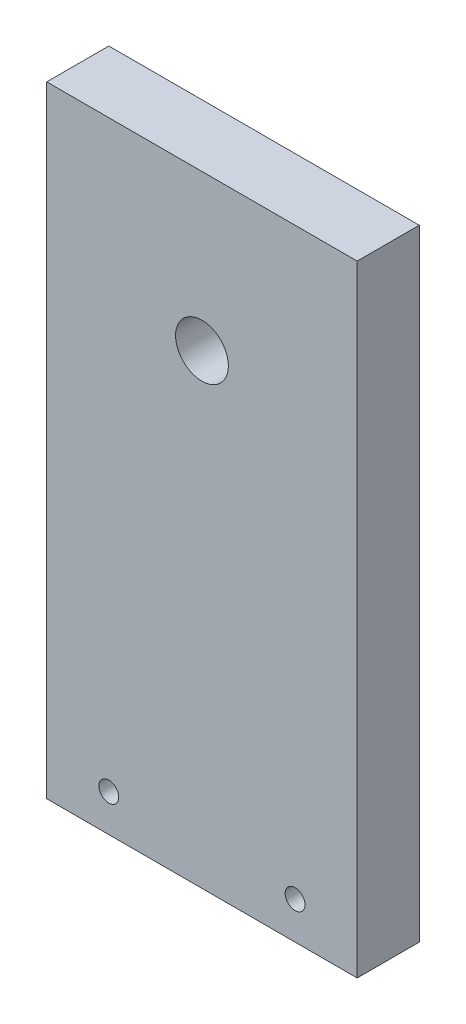
ISO-10303-21;
HEADER;
FILE_DESCRIPTION(('STEP AP214'),'2;1');
FILE_NAME('part.step','',(''),(''),'','','');
FILE_SCHEMA(('AUTOMOTIVE_DESIGN { 1 0 10303 214 1 1 1 1 }'));
ENDSEC;
DATA;
#1=APPLICATION_CONTEXT('core data for automotive mechanical design processes');
#2=APPLICATION_PROTOCOL_DEFINITION('international standard','automotive_design',2000,#1);
#3=PRODUCT_CONTEXT('',#1,'mechanical');
#4=PRODUCT('Part','Part','',(#3));
#5=PRODUCT_RELATED_PRODUCT_CATEGORY('part','',(#4));
#6=PRODUCT_DEFINITION_FORMATION('','',#4);
#7=PRODUCT_DEFINITION_CONTEXT('part definition',#1,'design');
#8=PRODUCT_DEFINITION('design','',#6,#7);
#9=PRODUCT_DEFINITION_SHAPE('','',#8);
#10=(LENGTH_UNIT() NAMED_UNIT(*) SI_UNIT(.MILLI.,.METRE.));
#11=(NAMED_UNIT(*) PLANE_ANGLE_UNIT() SI_UNIT($,.RADIAN.));
#12=(NAMED_UNIT(*) SI_UNIT($,.STERADIAN.) SOLID_ANGLE_UNIT());
#13=UNCERTAINTY_MEASURE_WITH_UNIT(LENGTH_MEASURE(1.E-05),#10,'distance_accuracy_value','');
#14=(GEOMETRIC_REPRESENTATION_CONTEXT(3) GLOBAL_UNCERTAINTY_ASSIGNED_CONTEXT((#13)) GLOBAL_UNIT_ASSIGNED_CONTEXT((#10,
#11,#12)) REPRESENTATION_CONTEXT('',''));
#15=CARTESIAN_POINT('',(0.,0.,0.));
#16=DIRECTION('',(0.,0.,1.));
#17=DIRECTION('',(1.,0.,0.));
#18=AXIS2_PLACEMENT_3D('',#15,#16,#17);
#19=CARTESIAN_POINT('',(-25.,0.,10.));
#20=DIRECTION('',(1.,0.,0.));
#21=DIRECTION('',(0.,0.,-1.));
#22=AXIS2_PLACEMENT_3D('',#19,#20,#21);
#23=PLANE('',#22);
#24=DIRECTION('',(0.,-1.,0.));
#25=VECTOR('',#24,1.);
#26=CARTESIAN_POINT('',(-25.,0.,0.));
#27=LINE('',#26,#25);
#28=CARTESIAN_POINT('',(-25.,100.,0.));
#29=VERTEX_POINT('',#28);
#30=CARTESIAN_POINT('',(-25.,0.,0.));
#31=VERTEX_POINT('',#30);
#32=EDGE_CURVE('E114',#29,#31,#27,.T.);
#33=ORIENTED_EDGE('',*,*,#32,.T.);
#34=DIRECTION('',(0.,0.,-1.));
#35=VECTOR('',#34,1.);
#36=CARTESIAN_POINT('',(-25.,0.,10.));
#37=LINE('',#36,#35);
#38=CARTESIAN_POINT('',(-25.,0.,10.));
#39=VERTEX_POINT('',#38);
#40=EDGE_CURVE('E11',#39,#31,#37,.T.);
#41=ORIENTED_EDGE('',*,*,#40,.F.);
#42=DIRECTION('',(0.,-1.,0.));
#43=VECTOR('',#42,1.);
#44=CARTESIAN_POINT('',(-25.,0.,10.));
#45=LINE('',#44,#43);
#46=CARTESIAN_POINT('',(-25.,100.,10.));
#47=VERTEX_POINT('',#46);
#48=EDGE_CURVE('E100',#47,#39,#45,.T.);
#49=ORIENTED_EDGE('',*,*,#48,.F.);
#50=DIRECTION('',(0.,0.,-1.));
#51=VECTOR('',#50,1.);
#52=CARTESIAN_POINT('',(-25.,100.,10.));
#53=LINE('',#52,#51);
#54=EDGE_CURVE('E108',#47,#29,#53,.T.);
#55=ORIENTED_EDGE('',*,*,#54,.T.);
#56=EDGE_LOOP('',(#33,#41,#49,#55));
#57=FACE_BOUND('',#56,.T.);
#58=ADVANCED_FACE('F44',(#57),#23,.F.);
#59=CARTESIAN_POINT('',(-25.,0.,10.));
#60=DIRECTION('',(0.,1.,0.));
#61=DIRECTION('',(0.,0.,1.));
#62=AXIS2_PLACEMENT_3D('',#59,#60,#61);
#63=PLANE('',#62);
#64=DIRECTION('',(1.,0.,0.));
#65=VECTOR('',#64,1.);
#66=CARTESIAN_POINT('',(-25.,0.,0.));
#67=LINE('',#66,#65);
#68=CARTESIAN_POINT('',(25.,0.,0.));
#69=VERTEX_POINT('',#68);
#70=EDGE_CURVE('E105',#31,#69,#67,.T.);
#71=ORIENTED_EDGE('',*,*,#70,.T.);
#72=DIRECTION('',(0.,0.,-1.));
#73=VECTOR('',#72,1.);
#74=CARTESIAN_POINT('',(25.,0.,10.));
#75=LINE('',#74,#73);
#76=CARTESIAN_POINT('',(25.,0.,10.));
#77=VERTEX_POINT('',#76);
#78=EDGE_CURVE('E53',#77,#69,#75,.T.);
#79=ORIENTED_EDGE('',*,*,#78,.F.);
#80=DIRECTION('',(1.,0.,0.));
#81=VECTOR('',#80,1.);
#82=CARTESIAN_POINT('',(-25.,0.,10.));
#83=LINE('',#82,#81);
#84=EDGE_CURVE('E95',#39,#77,#83,.T.);
#85=ORIENTED_EDGE('',*,*,#84,.F.);
#86=ORIENTED_EDGE('',*,*,#40,.T.);
#87=EDGE_LOOP('',(#71,#79,#85,#86));
#88=FACE_BOUND('',#87,.T.);
#89=ADVANCED_FACE('F101',(#88),#63,.F.);
#90=CARTESIAN_POINT('',(25.,0.,10.));
#91=DIRECTION('',(-1.,0.,0.));
#92=DIRECTION('',(0.,0.,1.));
#93=AXIS2_PLACEMENT_3D('',#90,#91,#92);
#94=PLANE('',#93);
#95=DIRECTION('',(0.,1.,0.));
#96=VECTOR('',#95,1.);
#97=CARTESIAN_POINT('',(25.,0.,0.));
#98=LINE('',#97,#96);
#99=CARTESIAN_POINT('',(25.,100.,0.));
#100=VERTEX_POINT('',#99);
#101=EDGE_CURVE('E76',#69,#100,#98,.T.);
#102=ORIENTED_EDGE('',*,*,#101,.T.);
#103=DIRECTION('',(0.,0.,-1.));
#104=VECTOR('',#103,1.);
#105=CARTESIAN_POINT('',(25.,100.,10.));
#106=LINE('',#105,#104);
#107=CARTESIAN_POINT('',(25.,100.,10.));
#108=VERTEX_POINT('',#107);
#109=EDGE_CURVE('E102',#108,#100,#106,.T.);
#110=ORIENTED_EDGE('',*,*,#109,.F.);
#111=DIRECTION('',(0.,1.,0.));
#112=VECTOR('',#111,1.);
#113=CARTESIAN_POINT('',(25.,0.,10.));
#114=LINE('',#113,#112);
#115=EDGE_CURVE('E92',#77,#108,#114,.T.);
#116=ORIENTED_EDGE('',*,*,#115,.F.);
#117=ORIENTED_EDGE('',*,*,#78,.T.);
#118=EDGE_LOOP('',(#102,#110,#116,#117));
#119=FACE_BOUND('',#118,.T.);
#120=ADVANCED_FACE('F104',(#119),#94,.F.);
#121=CARTESIAN_POINT('',(-25.,100.,10.));
#122=DIRECTION('',(0.,-1.,0.));
#123=DIRECTION('',(0.,0.,-1.));
#124=AXIS2_PLACEMENT_3D('',#121,#122,#123);
#125=PLANE('',#124);
#126=DIRECTION('',(-1.,0.,0.));
#127=VECTOR('',#126,1.);
#128=CARTESIAN_POINT('',(-25.,100.,0.));
#129=LINE('',#128,#127);
#130=EDGE_CURVE('E82',#100,#29,#129,.T.);
#131=ORIENTED_EDGE('',*,*,#130,.T.);
#132=ORIENTED_EDGE('',*,*,#54,.F.);
#133=DIRECTION('',(-1.,0.,0.));
#134=VECTOR('',#133,1.);
#135=CARTESIAN_POINT('',(-25.,100.,10.));
#136=LINE('',#135,#134);
#137=EDGE_CURVE('E65',#108,#47,#136,.T.);
#138=ORIENTED_EDGE('',*,*,#137,.F.);
#139=ORIENTED_EDGE('',*,*,#109,.T.);
#140=EDGE_LOOP('',(#131,#132,#138,#139));
#141=FACE_BOUND('',#140,.T.);
#142=ADVANCED_FACE('F130',(#141),#125,.F.);
#143=CARTESIAN_POINT('',(0.,0.,10.));
#144=DIRECTION('',(0.,0.,-1.));
#145=DIRECTION('',(-1.,0.,0.));
#146=AXIS2_PLACEMENT_3D('',#143,#144,#145);
#147=PLANE('',#146);
#148=CARTESIAN_POINT('',(0.,75.,10.));
#149=DIRECTION('',(0.,0.,-1.));
#150=DIRECTION('',(-1.,0.,0.));
#151=AXIS2_PLACEMENT_3D('',#148,#149,#150);
#152=CIRCLE('',#151,4.25);
#153=CARTESIAN_POINT('',(-4.25,75.,10.));
#154=VERTEX_POINT('',#153);
#155=EDGE_CURVE('E120',#154,#154,#152,.F.);
#156=ORIENTED_EDGE('',*,*,#155,.F.);
#157=EDGE_LOOP('',(#156));
#158=FACE_BOUND('',#157,.T.);
#159=CARTESIAN_POINT('',(15.,6.,10.));
#160=DIRECTION('',(0.,0.,-1.));
#161=DIRECTION('',(-1.,0.,0.));
#162=AXIS2_PLACEMENT_3D('',#159,#160,#161);
#163=CIRCLE('',#162,1.6);
#164=CARTESIAN_POINT('',(13.4,6.,10.));
#165=VERTEX_POINT('',#164);
#166=EDGE_CURVE('E136',#165,#165,#163,.F.);
#167=ORIENTED_EDGE('',*,*,#166,.F.);
#168=EDGE_LOOP('',(#167));
#169=FACE_BOUND('',#168,.T.);
#170=CARTESIAN_POINT('',(-15.,6.,10.));
#171=DIRECTION('',(0.,0.,-1.));
#172=DIRECTION('',(-1.,0.,0.));
#173=AXIS2_PLACEMENT_3D('',#170,#171,#172);
#174=CIRCLE('',#173,1.6);
#175=CARTESIAN_POINT('',(-16.6,6.,10.));
#176=VERTEX_POINT('',#175);
#177=EDGE_CURVE('E143',#176,#176,#174,.F.);
#178=ORIENTED_EDGE('',*,*,#177,.F.);
#179=EDGE_LOOP('',(#178));
#180=FACE_BOUND('',#179,.T.);
#181=ORIENTED_EDGE('',*,*,#48,.T.);
#182=ORIENTED_EDGE('',*,*,#84,.T.);
#183=ORIENTED_EDGE('',*,*,#115,.T.);
#184=ORIENTED_EDGE('',*,*,#137,.T.);
#185=EDGE_LOOP('',(#181,#182,#183,#184));
#186=FACE_BOUND('',#185,.T.);
#187=ADVANCED_FACE('F91',(#158,#169,#180,#186),#147,.F.);
#188=CARTESIAN_POINT('',(0.,0.,0.));
#189=DIRECTION('',(0.,0.,-1.));
#190=DIRECTION('',(-1.,0.,0.));
#191=AXIS2_PLACEMENT_3D('',#188,#189,#190);
#192=PLANE('',#191);
#193=CARTESIAN_POINT('',(0.,75.,0.));
#194=DIRECTION('',(0.,0.,1.));
#195=DIRECTION('',(1.,0.,0.));
#196=AXIS2_PLACEMENT_3D('',#193,#194,#195);
#197=CIRCLE('',#196,4.25);
#198=CARTESIAN_POINT('',(4.25,75.,0.));
#199=VERTEX_POINT('',#198);
#200=EDGE_CURVE('E144',#199,#199,#197,.T.);
#201=ORIENTED_EDGE('',*,*,#200,.T.);
#202=EDGE_LOOP('',(#201));
#203=FACE_BOUND('',#202,.T.);
#204=CARTESIAN_POINT('',(15.,6.,0.));
#205=DIRECTION('',(0.,0.,1.));
#206=DIRECTION('',(1.,0.,0.));
#207=AXIS2_PLACEMENT_3D('',#204,#205,#206);
#208=CIRCLE('',#207,1.6);
#209=CARTESIAN_POINT('',(16.6,6.,0.));
#210=VERTEX_POINT('',#209);
#211=EDGE_CURVE('E147',#210,#210,#208,.T.);
#212=ORIENTED_EDGE('',*,*,#211,.T.);
#213=EDGE_LOOP('',(#212));
#214=FACE_BOUND('',#213,.T.);
#215=CARTESIAN_POINT('',(-15.,6.,0.));
#216=DIRECTION('',(0.,0.,1.));
#217=DIRECTION('',(1.,0.,0.));
#218=AXIS2_PLACEMENT_3D('',#215,#216,#217);
#219=CIRCLE('',#218,1.6);
#220=CARTESIAN_POINT('',(-13.4,6.,0.));
#221=VERTEX_POINT('',#220);
#222=EDGE_CURVE('E148',#221,#221,#219,.T.);
#223=ORIENTED_EDGE('',*,*,#222,.T.);
#224=EDGE_LOOP('',(#223));
#225=FACE_BOUND('',#224,.T.);
#226=ORIENTED_EDGE('',*,*,#32,.F.);
#227=ORIENTED_EDGE('',*,*,#130,.F.);
#228=ORIENTED_EDGE('',*,*,#101,.F.);
#229=ORIENTED_EDGE('',*,*,#70,.F.);
#230=EDGE_LOOP('',(#226,#227,#228,#229));
#231=FACE_BOUND('',#230,.T.);
#232=ADVANCED_FACE('F128',(#203,#214,#225,#231),#192,.T.);
#233=CARTESIAN_POINT('',(-15.,6.,11.));
#234=DIRECTION('',(0.,0.,-1.));
#235=DIRECTION('',(-1.,0.,0.));
#236=AXIS2_PLACEMENT_3D('',#233,#234,#235);
#237=CYLINDRICAL_SURFACE('',#236,1.6);
#238=ORIENTED_EDGE('',*,*,#222,.F.);
#239=EDGE_LOOP('',(#238));
#240=FACE_BOUND('',#239,.T.);
#241=ORIENTED_EDGE('',*,*,#177,.T.);
#242=EDGE_LOOP('',(#241));
#243=FACE_BOUND('',#242,.T.);
#244=ADVANCED_FACE('F171',(#240,#243),#237,.F.);
#245=CARTESIAN_POINT('',(15.,6.,11.));
#246=DIRECTION('',(0.,0.,-1.));
#247=DIRECTION('',(-1.,0.,0.));
#248=AXIS2_PLACEMENT_3D('',#245,#246,#247);
#249=CYLINDRICAL_SURFACE('',#248,1.6);
#250=ORIENTED_EDGE('',*,*,#211,.F.);
#251=EDGE_LOOP('',(#250));
#252=FACE_BOUND('',#251,.T.);
#253=ORIENTED_EDGE('',*,*,#166,.T.);
#254=EDGE_LOOP('',(#253));
#255=FACE_BOUND('',#254,.T.);
#256=ADVANCED_FACE('F162',(#252,#255),#249,.F.);
#257=CARTESIAN_POINT('',(0.,75.,11.));
#258=DIRECTION('',(0.,0.,-1.));
#259=DIRECTION('',(-1.,0.,0.));
#260=AXIS2_PLACEMENT_3D('',#257,#258,#259);
#261=CYLINDRICAL_SURFACE('',#260,4.25);
#262=ORIENTED_EDGE('',*,*,#200,.F.);
#263=EDGE_LOOP('',(#262));
#264=FACE_BOUND('',#263,.T.);
#265=ORIENTED_EDGE('',*,*,#155,.T.);
#266=EDGE_LOOP('',(#265));
#267=FACE_BOUND('',#266,.T.);
#268=ADVANCED_FACE('F159',(#264,#267),#261,.F.);
#269=CLOSED_SHELL('',(#58,#89,#120,#142,#187,#232,#244,#256,#268));
#270=MANIFOLD_SOLID_BREP('B2',#269);
#271=ADVANCED_BREP_SHAPE_REPRESENTATION('',(#18,#270),#14);
#272=SHAPE_DEFINITION_REPRESENTATION(#9,#271);
ENDSEC;
END-ISO-10303-21;
